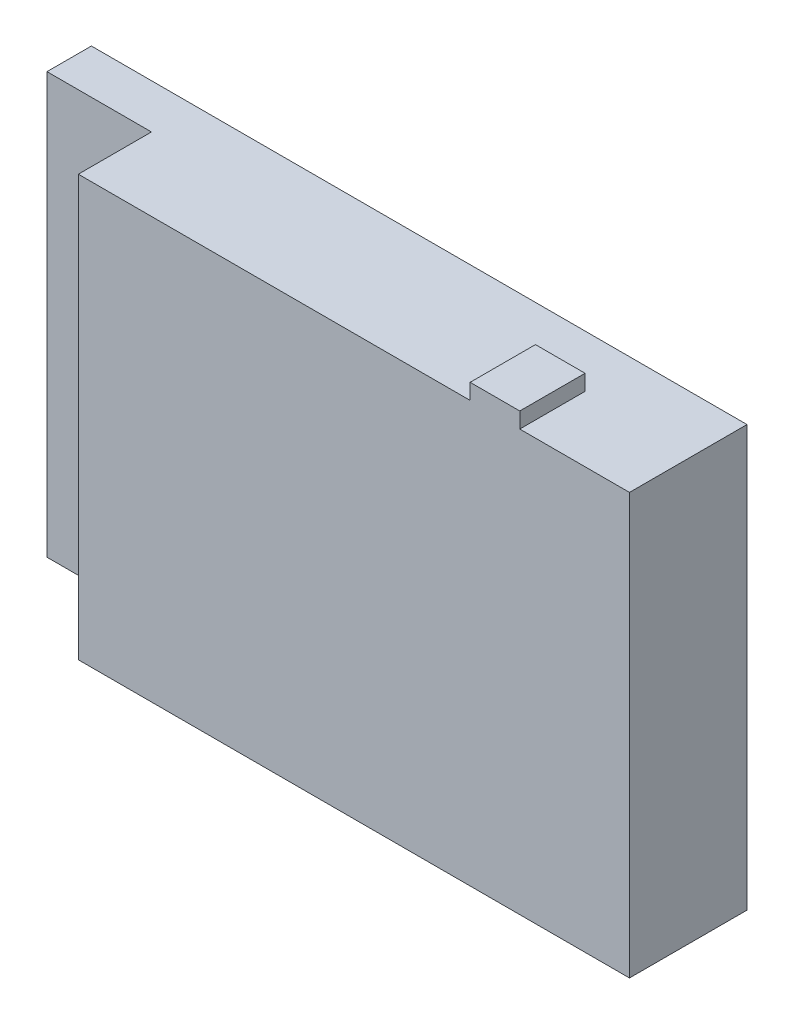
ISO-10303-21;
HEADER;
FILE_DESCRIPTION(('STEP AP214'),'2;1');
FILE_NAME('part.step','',(''),(''),'','','');
FILE_SCHEMA(('AUTOMOTIVE_DESIGN { 1 0 10303 214 1 1 1 1 }'));
ENDSEC;
DATA;
#1=APPLICATION_CONTEXT('core data for automotive mechanical design processes');
#2=APPLICATION_PROTOCOL_DEFINITION('international standard','automotive_design',2000,#1);
#3=PRODUCT_CONTEXT('',#1,'mechanical');
#4=PRODUCT('Part','Part','',(#3));
#5=PRODUCT_RELATED_PRODUCT_CATEGORY('part','',(#4));
#6=PRODUCT_DEFINITION_FORMATION('','',#4);
#7=PRODUCT_DEFINITION_CONTEXT('part definition',#1,'design');
#8=PRODUCT_DEFINITION('design','',#6,#7);
#9=PRODUCT_DEFINITION_SHAPE('','',#8);
#10=(LENGTH_UNIT() NAMED_UNIT(*) SI_UNIT(.MILLI.,.METRE.));
#11=(NAMED_UNIT(*) PLANE_ANGLE_UNIT() SI_UNIT($,.RADIAN.));
#12=(NAMED_UNIT(*) SI_UNIT($,.STERADIAN.) SOLID_ANGLE_UNIT());
#13=UNCERTAINTY_MEASURE_WITH_UNIT(LENGTH_MEASURE(1.E-05),#10,'distance_accuracy_value','');
#14=(GEOMETRIC_REPRESENTATION_CONTEXT(3) GLOBAL_UNCERTAINTY_ASSIGNED_CONTEXT((#13)) GLOBAL_UNIT_ASSIGNED_CONTEXT((#10,
#11,#12)) REPRESENTATION_CONTEXT('',''));
#15=CARTESIAN_POINT('',(0.,0.,0.));
#16=DIRECTION('',(0.,0.,1.));
#17=DIRECTION('',(1.,0.,0.));
#18=AXIS2_PLACEMENT_3D('',#15,#16,#17);
#19=CARTESIAN_POINT('',(-12.55,-8.05,4.5));
#20=DIRECTION('',(-1.,0.,0.));
#21=DIRECTION('',(0.,0.,1.));
#22=AXIS2_PLACEMENT_3D('',#19,#20,#21);
#23=PLANE('',#22);
#24=DIRECTION('',(0.,0.,-1.));
#25=VECTOR('',#24,1.);
#26=CARTESIAN_POINT('',(-12.55,-8.05,4.5));
#27=LINE('',#26,#25);
#28=CARTESIAN_POINT('',(-12.55,-8.05,1.7));
#29=VERTEX_POINT('',#28);
#30=CARTESIAN_POINT('',(-12.55,-8.05,0.));
#31=VERTEX_POINT('',#30);
#32=EDGE_CURVE('E159',#29,#31,#27,.T.);
#33=ORIENTED_EDGE('',*,*,#32,.F.);
#34=DIRECTION('',(0.,1.,0.));
#35=VECTOR('',#34,1.);
#36=CARTESIAN_POINT('',(-12.55,8.05,1.7));
#37=LINE('',#36,#35);
#38=CARTESIAN_POINT('',(-12.55,8.05,1.7));
#39=VERTEX_POINT('',#38);
#40=EDGE_CURVE('E178',#29,#39,#37,.T.);
#41=ORIENTED_EDGE('',*,*,#40,.T.);
#42=DIRECTION('',(0.,0.,-1.));
#43=VECTOR('',#42,1.);
#44=CARTESIAN_POINT('',(-12.55,8.05,4.5));
#45=LINE('',#44,#43);
#46=CARTESIAN_POINT('',(-12.55,8.05,0.));
#47=VERTEX_POINT('',#46);
#48=EDGE_CURVE('E46',#39,#47,#45,.T.);
#49=ORIENTED_EDGE('',*,*,#48,.T.);
#50=DIRECTION('',(0.,1.,0.));
#51=VECTOR('',#50,1.);
#52=CARTESIAN_POINT('',(-12.55,-8.05,0.));
#53=LINE('',#52,#51);
#54=EDGE_CURVE('E148',#31,#47,#53,.T.);
#55=ORIENTED_EDGE('',*,*,#54,.F.);
#56=EDGE_LOOP('',(#33,#41,#49,#55));
#57=FACE_BOUND('',#56,.T.);
#58=ADVANCED_FACE('F43',(#57),#23,.T.);
#59=CARTESIAN_POINT('',(8.35,0.,4.5));
#60=DIRECTION('',(-1.,0.,0.));
#61=DIRECTION('',(0.,0.,1.));
#62=AXIS2_PLACEMENT_3D('',#59,#60,#61);
#63=PLANE('',#62);
#64=DIRECTION('',(0.,-1.,0.));
#65=VECTOR('',#64,1.);
#66=CARTESIAN_POINT('',(8.35,8.05,2.));
#67=LINE('',#66,#65);
#68=CARTESIAN_POINT('',(8.35,8.65,2.));
#69=VERTEX_POINT('',#68);
#70=CARTESIAN_POINT('',(8.35,8.05,2.));
#71=VERTEX_POINT('',#70);
#72=EDGE_CURVE('E193',#69,#71,#67,.T.);
#73=ORIENTED_EDGE('',*,*,#72,.F.);
#74=DIRECTION('',(0.,0.,-1.));
#75=VECTOR('',#74,1.);
#76=CARTESIAN_POINT('',(8.35,8.65,4.5));
#77=LINE('',#76,#75);
#78=CARTESIAN_POINT('',(8.35,8.65,4.5));
#79=VERTEX_POINT('',#78);
#80=EDGE_CURVE('E51',#79,#69,#77,.T.);
#81=ORIENTED_EDGE('',*,*,#80,.F.);
#82=DIRECTION('',(0.,1.,0.));
#83=VECTOR('',#82,1.);
#84=CARTESIAN_POINT('',(8.35,0.,4.5));
#85=LINE('',#84,#83);
#86=CARTESIAN_POINT('',(8.35,8.05,4.5));
#87=VERTEX_POINT('',#86);
#88=EDGE_CURVE('E161',#87,#79,#85,.T.);
#89=ORIENTED_EDGE('',*,*,#88,.F.);
#90=DIRECTION('',(0.,0.,-1.));
#91=VECTOR('',#90,1.);
#92=CARTESIAN_POINT('',(8.35,8.05,4.5));
#93=LINE('',#92,#91);
#94=EDGE_CURVE('E13',#87,#71,#93,.T.);
#95=ORIENTED_EDGE('',*,*,#94,.T.);
#96=EDGE_LOOP('',(#73,#81,#89,#95));
#97=FACE_BOUND('',#96,.T.);
#98=ADVANCED_FACE('F223',(#97),#63,.F.);
#99=CARTESIAN_POINT('',(0.,8.65,4.5));
#100=DIRECTION('',(0.,1.,0.));
#101=DIRECTION('',(0.,0.,1.));
#102=AXIS2_PLACEMENT_3D('',#99,#100,#101);
#103=PLANE('',#102);
#104=ORIENTED_EDGE('',*,*,#80,.T.);
#105=DIRECTION('',(1.,0.,0.));
#106=VECTOR('',#105,1.);
#107=CARTESIAN_POINT('',(6.45,8.65,2.));
#108=LINE('',#107,#106);
#109=CARTESIAN_POINT('',(6.45,8.65,2.));
#110=VERTEX_POINT('',#109);
#111=EDGE_CURVE('E191',#110,#69,#108,.T.);
#112=ORIENTED_EDGE('',*,*,#111,.F.);
#113=DIRECTION('',(0.,0.,-1.));
#114=VECTOR('',#113,1.);
#115=CARTESIAN_POINT('',(6.45,8.65,4.5));
#116=LINE('',#115,#114);
#117=CARTESIAN_POINT('',(6.45,8.65,4.5));
#118=VERTEX_POINT('',#117);
#119=EDGE_CURVE('E205',#118,#110,#116,.T.);
#120=ORIENTED_EDGE('',*,*,#119,.F.);
#121=DIRECTION('',(1.,0.,0.));
#122=VECTOR('',#121,1.);
#123=CARTESIAN_POINT('',(0.,8.65,4.5));
#124=LINE('',#123,#122);
#125=EDGE_CURVE('E197',#118,#79,#124,.T.);
#126=ORIENTED_EDGE('',*,*,#125,.T.);
#127=EDGE_LOOP('',(#104,#112,#120,#126));
#128=FACE_BOUND('',#127,.T.);
#129=ADVANCED_FACE('F217',(#128),#103,.T.);
#130=CARTESIAN_POINT('',(6.45,0.,4.5));
#131=DIRECTION('',(-1.,0.,0.));
#132=DIRECTION('',(0.,0.,1.));
#133=AXIS2_PLACEMENT_3D('',#130,#131,#132);
#134=PLANE('',#133);
#135=ORIENTED_EDGE('',*,*,#119,.T.);
#136=DIRECTION('',(0.,1.,0.));
#137=VECTOR('',#136,1.);
#138=CARTESIAN_POINT('',(6.45,8.05,2.));
#139=LINE('',#138,#137);
#140=CARTESIAN_POINT('',(6.45,8.05,2.));
#141=VERTEX_POINT('',#140);
#142=EDGE_CURVE('E189',#141,#110,#139,.T.);
#143=ORIENTED_EDGE('',*,*,#142,.F.);
#144=DIRECTION('',(0.,0.,-1.));
#145=VECTOR('',#144,1.);
#146=CARTESIAN_POINT('',(6.45,8.05,4.5));
#147=LINE('',#146,#145);
#148=CARTESIAN_POINT('',(6.45,8.05,4.5));
#149=VERTEX_POINT('',#148);
#150=EDGE_CURVE('E203',#149,#141,#147,.T.);
#151=ORIENTED_EDGE('',*,*,#150,.F.);
#152=DIRECTION('',(0.,1.,0.));
#153=VECTOR('',#152,1.);
#154=CARTESIAN_POINT('',(6.45,0.,4.5));
#155=LINE('',#154,#153);
#156=EDGE_CURVE('E200',#149,#118,#155,.T.);
#157=ORIENTED_EDGE('',*,*,#156,.T.);
#158=EDGE_LOOP('',(#135,#143,#151,#157));
#159=FACE_BOUND('',#158,.T.);
#160=ADVANCED_FACE('F212',(#159),#134,.T.);
#161=CARTESIAN_POINT('',(0.,0.,4.5));
#162=DIRECTION('',(0.,0.,1.));
#163=DIRECTION('',(1.,0.,0.));
#164=AXIS2_PLACEMENT_3D('',#161,#162,#163);
#165=PLANE('',#164);
#166=DIRECTION('',(0.,1.,0.));
#167=VECTOR('',#166,1.);
#168=CARTESIAN_POINT('',(-8.54999999999999,8.05,4.5));
#169=LINE('',#168,#167);
#170=CARTESIAN_POINT('',(-8.54999999999999,-8.05,4.5));
#171=VERTEX_POINT('',#170);
#172=CARTESIAN_POINT('',(-8.54999999999999,8.05,4.5));
#173=VERTEX_POINT('',#172);
#174=EDGE_CURVE('E122',#171,#173,#169,.T.);
#175=ORIENTED_EDGE('',*,*,#174,.F.);
#176=DIRECTION('',(1.,0.,0.));
#177=VECTOR('',#176,1.);
#178=CARTESIAN_POINT('',(-12.55,-8.05,4.5));
#179=LINE('',#178,#177);
#180=CARTESIAN_POINT('',(12.55,-8.05,4.5));
#181=VERTEX_POINT('',#180);
#182=EDGE_CURVE('E133',#171,#181,#179,.T.);
#183=ORIENTED_EDGE('',*,*,#182,.T.);
#184=DIRECTION('',(0.,1.,0.));
#185=VECTOR('',#184,1.);
#186=CARTESIAN_POINT('',(12.55,-8.05,4.5));
#187=LINE('',#186,#185);
#188=CARTESIAN_POINT('',(12.55,8.05,4.5));
#189=VERTEX_POINT('',#188);
#190=EDGE_CURVE('E142',#181,#189,#187,.T.);
#191=ORIENTED_EDGE('',*,*,#190,.T.);
#192=DIRECTION('',(1.,0.,0.));
#193=VECTOR('',#192,1.);
#194=CARTESIAN_POINT('',(-12.55,8.05,4.5));
#195=LINE('',#194,#193);
#196=EDGE_CURVE('E158',#87,#189,#195,.T.);
#197=ORIENTED_EDGE('',*,*,#196,.F.);
#198=ORIENTED_EDGE('',*,*,#88,.T.);
#199=ORIENTED_EDGE('',*,*,#125,.F.);
#200=ORIENTED_EDGE('',*,*,#156,.F.);
#201=EDGE_CURVE('E136',#173,#149,#195,.T.);
#202=ORIENTED_EDGE('',*,*,#201,.F.);
#203=EDGE_LOOP('',(#175,#183,#191,#197,#198,#199,#200,#202));
#204=FACE_BOUND('',#203,.T.);
#205=ADVANCED_FACE('F131',(#204),#165,.T.);
#206=CARTESIAN_POINT('',(0.,0.,0.));
#207=DIRECTION('',(0.,0.,1.));
#208=DIRECTION('',(1.,0.,0.));
#209=AXIS2_PLACEMENT_3D('',#206,#207,#208);
#210=PLANE('',#209);
#211=DIRECTION('',(1.,0.,0.));
#212=VECTOR('',#211,1.);
#213=CARTESIAN_POINT('',(-12.55,8.05,0.));
#214=LINE('',#213,#212);
#215=CARTESIAN_POINT('',(12.55,8.05,0.));
#216=VERTEX_POINT('',#215);
#217=EDGE_CURVE('E151',#47,#216,#214,.T.);
#218=ORIENTED_EDGE('',*,*,#217,.T.);
#219=DIRECTION('',(0.,1.,0.));
#220=VECTOR('',#219,1.);
#221=CARTESIAN_POINT('',(12.55,-8.05,0.));
#222=LINE('',#221,#220);
#223=CARTESIAN_POINT('',(12.55,-8.05,0.));
#224=VERTEX_POINT('',#223);
#225=EDGE_CURVE('E153',#224,#216,#222,.T.);
#226=ORIENTED_EDGE('',*,*,#225,.F.);
#227=DIRECTION('',(1.,0.,0.));
#228=VECTOR('',#227,1.);
#229=CARTESIAN_POINT('',(-12.55,-8.05,0.));
#230=LINE('',#229,#228);
#231=EDGE_CURVE('E156',#31,#224,#230,.T.);
#232=ORIENTED_EDGE('',*,*,#231,.F.);
#233=ORIENTED_EDGE('',*,*,#54,.T.);
#234=EDGE_LOOP('',(#218,#226,#232,#233));
#235=FACE_BOUND('',#234,.T.);
#236=ADVANCED_FACE('F173',(#235),#210,.F.);
#237=CARTESIAN_POINT('',(-12.55,-8.05,4.5));
#238=DIRECTION('',(0.,1.,0.));
#239=DIRECTION('',(0.,0.,1.));
#240=AXIS2_PLACEMENT_3D('',#237,#238,#239);
#241=PLANE('',#240);
#242=ORIENTED_EDGE('',*,*,#182,.F.);
#243=DIRECTION('',(0.,0.,1.));
#244=VECTOR('',#243,1.);
#245=CARTESIAN_POINT('',(-8.54999999999999,-8.05,-16.5894544816881));
#246=LINE('',#245,#244);
#247=CARTESIAN_POINT('',(-8.54999999999999,-8.05,1.69999999999999));
#248=VERTEX_POINT('',#247);
#249=EDGE_CURVE('E119',#248,#171,#246,.T.);
#250=ORIENTED_EDGE('',*,*,#249,.F.);
#251=DIRECTION('',(-1.,0.,0.));
#252=VECTOR('',#251,1.);
#253=CARTESIAN_POINT('',(-12.55,-8.05,1.7));
#254=LINE('',#253,#252);
#255=EDGE_CURVE('E183',#248,#29,#254,.T.);
#256=ORIENTED_EDGE('',*,*,#255,.T.);
#257=ORIENTED_EDGE('',*,*,#32,.T.);
#258=ORIENTED_EDGE('',*,*,#231,.T.);
#259=DIRECTION('',(0.,0.,-1.));
#260=VECTOR('',#259,1.);
#261=CARTESIAN_POINT('',(12.55,-8.05,4.5));
#262=LINE('',#261,#260);
#263=EDGE_CURVE('E140',#181,#224,#262,.T.);
#264=ORIENTED_EDGE('',*,*,#263,.F.);
#265=EDGE_LOOP('',(#242,#250,#256,#257,#258,#264));
#266=FACE_BOUND('',#265,.T.);
#267=ADVANCED_FACE('F138',(#266),#241,.F.);
#268=CARTESIAN_POINT('',(12.55,-8.05,4.5));
#269=DIRECTION('',(-1.,0.,0.));
#270=DIRECTION('',(0.,0.,1.));
#271=AXIS2_PLACEMENT_3D('',#268,#269,#270);
#272=PLANE('',#271);
#273=ORIENTED_EDGE('',*,*,#225,.T.);
#274=DIRECTION('',(0.,0.,-1.));
#275=VECTOR('',#274,1.);
#276=CARTESIAN_POINT('',(12.55,8.05,4.5));
#277=LINE('',#276,#275);
#278=EDGE_CURVE('E144',#189,#216,#277,.T.);
#279=ORIENTED_EDGE('',*,*,#278,.F.);
#280=ORIENTED_EDGE('',*,*,#190,.F.);
#281=ORIENTED_EDGE('',*,*,#263,.T.);
#282=EDGE_LOOP('',(#273,#279,#280,#281));
#283=FACE_BOUND('',#282,.T.);
#284=ADVANCED_FACE('F170',(#283),#272,.F.);
#285=CARTESIAN_POINT('',(-12.55,8.05,4.5));
#286=DIRECTION('',(0.,1.,0.));
#287=DIRECTION('',(0.,0.,1.));
#288=AXIS2_PLACEMENT_3D('',#285,#286,#287);
#289=PLANE('',#288);
#290=DIRECTION('',(0.,0.,1.));
#291=VECTOR('',#290,1.);
#292=CARTESIAN_POINT('',(-8.54999999999999,8.05,-16.5894544816881));
#293=LINE('',#292,#291);
#294=CARTESIAN_POINT('',(-8.54999999999999,8.05,1.7));
#295=VERTEX_POINT('',#294);
#296=EDGE_CURVE('E59',#295,#173,#293,.T.);
#297=ORIENTED_EDGE('',*,*,#296,.T.);
#298=ORIENTED_EDGE('',*,*,#201,.T.);
#299=ORIENTED_EDGE('',*,*,#150,.T.);
#300=DIRECTION('',(-1.,0.,0.));
#301=VECTOR('',#300,1.);
#302=CARTESIAN_POINT('',(6.45,8.05,2.));
#303=LINE('',#302,#301);
#304=EDGE_CURVE('E67',#71,#141,#303,.T.);
#305=ORIENTED_EDGE('',*,*,#304,.F.);
#306=ORIENTED_EDGE('',*,*,#94,.F.);
#307=ORIENTED_EDGE('',*,*,#196,.T.);
#308=ORIENTED_EDGE('',*,*,#278,.T.);
#309=ORIENTED_EDGE('',*,*,#217,.F.);
#310=ORIENTED_EDGE('',*,*,#48,.F.);
#311=DIRECTION('',(1.,0.,0.));
#312=VECTOR('',#311,1.);
#313=CARTESIAN_POINT('',(-12.55,8.05,1.7));
#314=LINE('',#313,#312);
#315=EDGE_CURVE('E180',#39,#295,#314,.T.);
#316=ORIENTED_EDGE('',*,*,#315,.T.);
#317=EDGE_LOOP('',(#297,#298,#299,#305,#306,#307,#308,#309,#310,#316));
#318=FACE_BOUND('',#317,.T.);
#319=ADVANCED_FACE('F165',(#318),#289,.T.);
#320=CARTESIAN_POINT('',(0.,0.,2.));
#321=DIRECTION('',(0.,0.,-1.));
#322=DIRECTION('',(-1.,0.,0.));
#323=AXIS2_PLACEMENT_3D('',#320,#321,#322);
#324=PLANE('',#323);
#325=ORIENTED_EDGE('',*,*,#142,.T.);
#326=ORIENTED_EDGE('',*,*,#111,.T.);
#327=ORIENTED_EDGE('',*,*,#72,.T.);
#328=ORIENTED_EDGE('',*,*,#304,.T.);
#329=EDGE_LOOP('',(#325,#326,#327,#328));
#330=FACE_BOUND('',#329,.T.);
#331=ADVANCED_FACE('F221',(#330),#324,.T.);
#332=CARTESIAN_POINT('',(-8.54999999999999,8.05,-16.5894544816881));
#333=DIRECTION('',(1.,0.,0.));
#334=DIRECTION('',(0.,1.,0.));
#335=AXIS2_PLACEMENT_3D('',#332,#333,#334);
#336=PLANE('',#335);
#337=DIRECTION('',(0.,-1.,0.));
#338=VECTOR('',#337,1.);
#339=CARTESIAN_POINT('',(-8.54999999999999,8.05,1.7));
#340=LINE('',#339,#338);
#341=EDGE_CURVE('E123',#295,#248,#340,.T.);
#342=ORIENTED_EDGE('',*,*,#341,.T.);
#343=ORIENTED_EDGE('',*,*,#249,.T.);
#344=ORIENTED_EDGE('',*,*,#174,.T.);
#345=ORIENTED_EDGE('',*,*,#296,.F.);
#346=EDGE_LOOP('',(#342,#343,#344,#345));
#347=FACE_BOUND('',#346,.T.);
#348=ADVANCED_FACE('F121',(#347),#336,.F.);
#349=CARTESIAN_POINT('',(0.,0.,1.7));
#350=DIRECTION('',(0.,0.,1.));
#351=DIRECTION('',(1.,0.,0.));
#352=AXIS2_PLACEMENT_3D('',#349,#350,#351);
#353=PLANE('',#352);
#354=ORIENTED_EDGE('',*,*,#40,.F.);
#355=ORIENTED_EDGE('',*,*,#255,.F.);
#356=ORIENTED_EDGE('',*,*,#341,.F.);
#357=ORIENTED_EDGE('',*,*,#315,.F.);
#358=EDGE_LOOP('',(#354,#355,#356,#357));
#359=FACE_BOUND('',#358,.T.);
#360=ADVANCED_FACE('F253',(#359),#353,.T.);
#361=CLOSED_SHELL('',(#58,#98,#129,#160,#205,#236,#267,#284,#319,#331,#348,#360));
#362=MANIFOLD_SOLID_BREP('B2',#361);
#363=ADVANCED_BREP_SHAPE_REPRESENTATION('',(#18,#362),#14);
#364=SHAPE_DEFINITION_REPRESENTATION(#9,#363);
ENDSEC;
END-ISO-10303-21;
